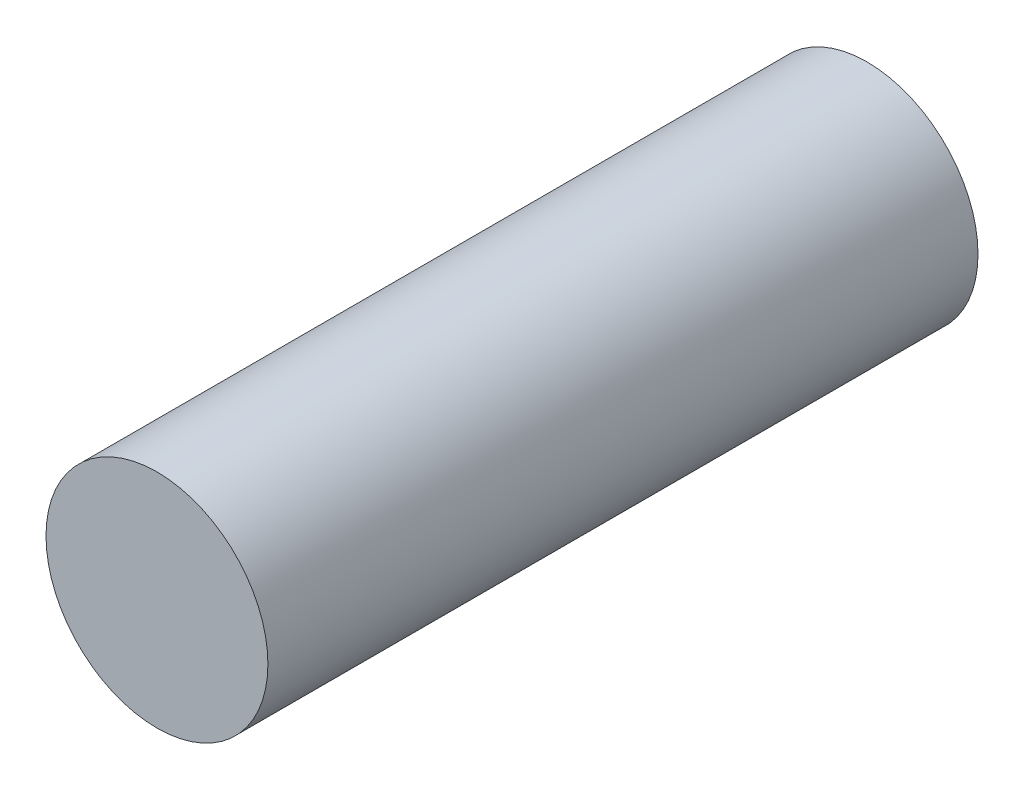
ISO-10303-21;
HEADER;
FILE_DESCRIPTION(('STEP AP214'),'2;1');
FILE_NAME('part.step','',(''),(''),'','','');
FILE_SCHEMA(('AUTOMOTIVE_DESIGN { 1 0 10303 214 1 1 1 1 }'));
ENDSEC;
DATA;
#1=APPLICATION_CONTEXT('core data for automotive mechanical design processes');
#2=APPLICATION_PROTOCOL_DEFINITION('international standard','automotive_design',2000,#1);
#3=PRODUCT_CONTEXT('',#1,'mechanical');
#4=PRODUCT('Part','Part','',(#3));
#5=PRODUCT_RELATED_PRODUCT_CATEGORY('part','',(#4));
#6=PRODUCT_DEFINITION_FORMATION('','',#4);
#7=PRODUCT_DEFINITION_CONTEXT('part definition',#1,'design');
#8=PRODUCT_DEFINITION('design','',#6,#7);
#9=PRODUCT_DEFINITION_SHAPE('','',#8);
#10=(LENGTH_UNIT() NAMED_UNIT(*) SI_UNIT(.MILLI.,.METRE.));
#11=(NAMED_UNIT(*) PLANE_ANGLE_UNIT() SI_UNIT($,.RADIAN.));
#12=(NAMED_UNIT(*) SI_UNIT($,.STERADIAN.) SOLID_ANGLE_UNIT());
#13=UNCERTAINTY_MEASURE_WITH_UNIT(LENGTH_MEASURE(1.E-05),#10,'distance_accuracy_value','');
#14=(GEOMETRIC_REPRESENTATION_CONTEXT(3) GLOBAL_UNCERTAINTY_ASSIGNED_CONTEXT((#13)) GLOBAL_UNIT_ASSIGNED_CONTEXT((#10,
#11,#12)) REPRESENTATION_CONTEXT('',''));
#15=CARTESIAN_POINT('',(0.,0.,0.));
#16=DIRECTION('',(0.,0.,1.));
#17=DIRECTION('',(1.,0.,0.));
#18=AXIS2_PLACEMENT_3D('',#15,#16,#17);
#19=CARTESIAN_POINT('',(0.,0.,16.));
#20=DIRECTION('',(0.,0.,-1.));
#21=DIRECTION('',(-1.,0.,0.));
#22=AXIS2_PLACEMENT_3D('',#19,#20,#21);
#23=CYLINDRICAL_SURFACE('',#22,2.5);
#24=CARTESIAN_POINT('',(0.,0.,16.));
#25=DIRECTION('',(0.,0.,1.));
#26=DIRECTION('',(1.,0.,0.));
#27=AXIS2_PLACEMENT_3D('',#24,#25,#26);
#28=CIRCLE('',#27,2.5);
#29=CARTESIAN_POINT('',(2.5,0.,16.));
#30=VERTEX_POINT('',#29);
#31=EDGE_CURVE('E10',#30,#30,#28,.T.);
#32=ORIENTED_EDGE('',*,*,#31,.F.);
#33=EDGE_LOOP('',(#32));
#34=FACE_BOUND('',#33,.T.);
#35=CARTESIAN_POINT('',(0.,0.,0.));
#36=DIRECTION('',(0.,0.,1.));
#37=DIRECTION('',(1.,0.,0.));
#38=AXIS2_PLACEMENT_3D('',#35,#36,#37);
#39=CIRCLE('',#38,2.5);
#40=CARTESIAN_POINT('',(2.5,0.,0.));
#41=VERTEX_POINT('',#40);
#42=EDGE_CURVE('E34',#41,#41,#39,.T.);
#43=ORIENTED_EDGE('',*,*,#42,.T.);
#44=EDGE_LOOP('',(#43));
#45=FACE_BOUND('',#44,.T.);
#46=ADVANCED_FACE('F31',(#34,#45),#23,.T.);
#47=CARTESIAN_POINT('',(0.,0.,16.));
#48=DIRECTION('',(0.,0.,1.));
#49=DIRECTION('',(1.,0.,0.));
#50=AXIS2_PLACEMENT_3D('',#47,#48,#49);
#51=PLANE('',#50);
#52=ORIENTED_EDGE('',*,*,#31,.T.);
#53=EDGE_LOOP('',(#52));
#54=FACE_BOUND('',#53,.T.);
#55=ADVANCED_FACE('F46',(#54),#51,.T.);
#56=CARTESIAN_POINT('',(0.,0.,0.));
#57=DIRECTION('',(0.,0.,1.));
#58=DIRECTION('',(1.,0.,0.));
#59=AXIS2_PLACEMENT_3D('',#56,#57,#58);
#60=PLANE('',#59);
#61=ORIENTED_EDGE('',*,*,#42,.F.);
#62=EDGE_LOOP('',(#61));
#63=FACE_BOUND('',#62,.T.);
#64=ADVANCED_FACE('F44',(#63),#60,.F.);
#65=CLOSED_SHELL('',(#46,#55,#64));
#66=MANIFOLD_SOLID_BREP('B2',#65);
#67=ADVANCED_BREP_SHAPE_REPRESENTATION('',(#18,#66),#14);
#68=SHAPE_DEFINITION_REPRESENTATION(#9,#67);
ENDSEC;
END-ISO-10303-21;
